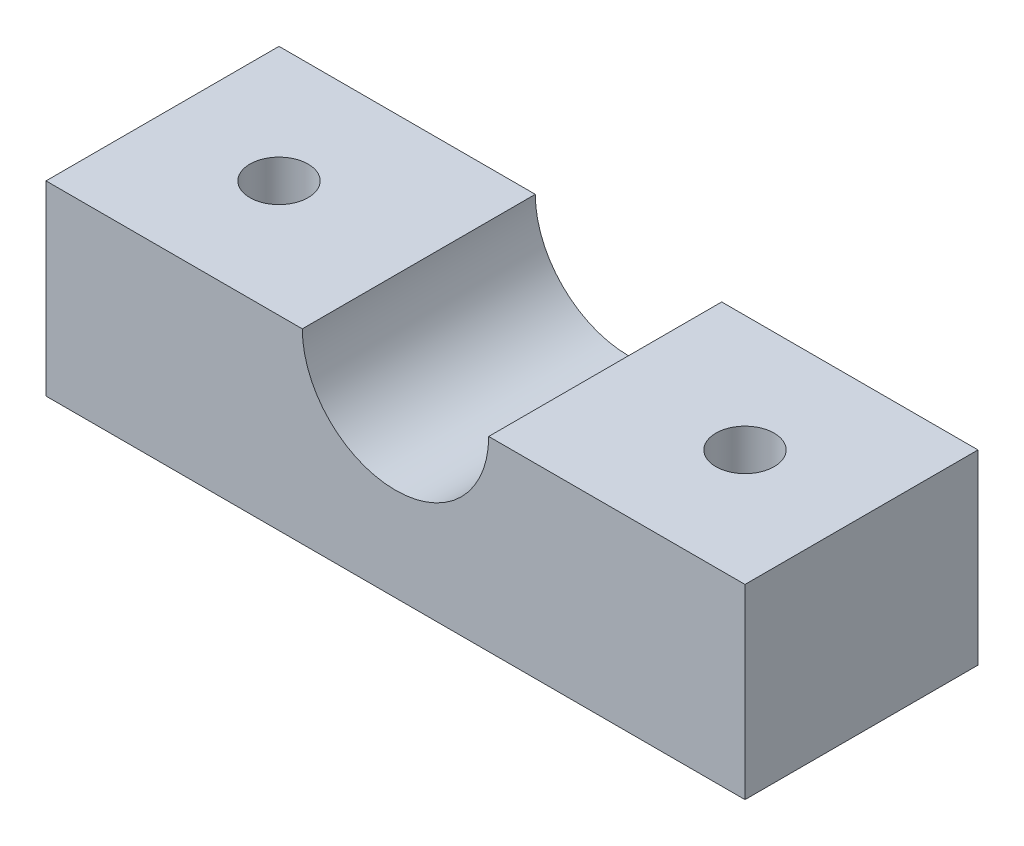
ISO-10303-21;
HEADER;
FILE_DESCRIPTION(('STEP AP214'),'2;1');
FILE_NAME('part.step','',(''),(''),'','','');
FILE_SCHEMA(('AUTOMOTIVE_DESIGN { 1 0 10303 214 1 1 1 1 }'));
ENDSEC;
DATA;
#1=APPLICATION_CONTEXT('core data for automotive mechanical design processes');
#2=APPLICATION_PROTOCOL_DEFINITION('international standard','automotive_design',2000,#1);
#3=PRODUCT_CONTEXT('',#1,'mechanical');
#4=PRODUCT('Part','Part','',(#3));
#5=PRODUCT_RELATED_PRODUCT_CATEGORY('part','',(#4));
#6=PRODUCT_DEFINITION_FORMATION('','',#4);
#7=PRODUCT_DEFINITION_CONTEXT('part definition',#1,'design');
#8=PRODUCT_DEFINITION('design','',#6,#7);
#9=PRODUCT_DEFINITION_SHAPE('','',#8);
#10=(LENGTH_UNIT() NAMED_UNIT(*) SI_UNIT(.MILLI.,.METRE.));
#11=(NAMED_UNIT(*) PLANE_ANGLE_UNIT() SI_UNIT($,.RADIAN.));
#12=(NAMED_UNIT(*) SI_UNIT($,.STERADIAN.) SOLID_ANGLE_UNIT());
#13=UNCERTAINTY_MEASURE_WITH_UNIT(LENGTH_MEASURE(1.E-05),#10,'distance_accuracy_value','');
#14=(GEOMETRIC_REPRESENTATION_CONTEXT(3) GLOBAL_UNCERTAINTY_ASSIGNED_CONTEXT((#13)) GLOBAL_UNIT_ASSIGNED_CONTEXT((#10,
#11,#12)) REPRESENTATION_CONTEXT('',''));
#15=CARTESIAN_POINT('',(0.,0.,0.));
#16=DIRECTION('',(0.,0.,1.));
#17=DIRECTION('',(1.,0.,0.));
#18=AXIS2_PLACEMENT_3D('',#15,#16,#17);
#19=CARTESIAN_POINT('',(0.,0.,10.));
#20=DIRECTION('',(0.,1.,0.));
#21=DIRECTION('',(0.,0.,1.));
#22=AXIS2_PLACEMENT_3D('',#19,#20,#21);
#23=PLANE('',#22);
#24=CARTESIAN_POINT('',(25.,0.,5.));
#25=DIRECTION('',(0.,-1.,0.));
#26=DIRECTION('',(0.,0.,-1.));
#27=AXIS2_PLACEMENT_3D('',#24,#25,#26);
#28=CIRCLE('',#27,1.25);
#29=CARTESIAN_POINT('',(25.,0.,3.75));
#30=VERTEX_POINT('',#29);
#31=EDGE_CURVE('E196',#30,#30,#28,.T.);
#32=ORIENTED_EDGE('',*,*,#31,.F.);
#33=EDGE_LOOP('',(#32));
#34=FACE_BOUND('',#33,.T.);
#35=DIRECTION('',(1.,0.,0.));
#36=VECTOR('',#35,1.);
#37=CARTESIAN_POINT('',(0.,0.,0.));
#38=LINE('',#37,#36);
#39=CARTESIAN_POINT('',(0.,0.,0.));
#40=VERTEX_POINT('',#39);
#41=CARTESIAN_POINT('',(30.,0.,0.));
#42=VERTEX_POINT('',#41);
#43=EDGE_CURVE('E137',#40,#42,#38,.T.);
#44=ORIENTED_EDGE('',*,*,#43,.T.);
#45=DIRECTION('',(0.,0.,-1.));
#46=VECTOR('',#45,1.);
#47=CARTESIAN_POINT('',(30.,0.,10.));
#48=LINE('',#47,#46);
#49=CARTESIAN_POINT('',(30.,0.,10.));
#50=VERTEX_POINT('',#49);
#51=EDGE_CURVE('E53',#50,#42,#48,.T.);
#52=ORIENTED_EDGE('',*,*,#51,.F.);
#53=DIRECTION('',(1.,0.,0.));
#54=VECTOR('',#53,1.);
#55=CARTESIAN_POINT('',(0.,0.,10.));
#56=LINE('',#55,#54);
#57=CARTESIAN_POINT('',(0.,0.,10.));
#58=VERTEX_POINT('',#57);
#59=EDGE_CURVE('E98',#58,#50,#56,.T.);
#60=ORIENTED_EDGE('',*,*,#59,.F.);
#61=DIRECTION('',(0.,0.,-1.));
#62=VECTOR('',#61,1.);
#63=CARTESIAN_POINT('',(0.,0.,10.));
#64=LINE('',#63,#62);
#65=EDGE_CURVE('E11',#58,#40,#64,.T.);
#66=ORIENTED_EDGE('',*,*,#65,.T.);
#67=EDGE_LOOP('',(#44,#52,#60,#66));
#68=FACE_BOUND('',#67,.T.);
#69=CARTESIAN_POINT('',(5.,0.,5.));
#70=DIRECTION('',(0.,-1.,0.));
#71=DIRECTION('',(0.,0.,-1.));
#72=AXIS2_PLACEMENT_3D('',#69,#70,#71);
#73=CIRCLE('',#72,1.25);
#74=CARTESIAN_POINT('',(5.,0.,3.75));
#75=VERTEX_POINT('',#74);
#76=EDGE_CURVE('E210',#75,#75,#73,.T.);
#77=ORIENTED_EDGE('',*,*,#76,.F.);
#78=EDGE_LOOP('',(#77));
#79=FACE_BOUND('',#78,.T.);
#80=ADVANCED_FACE('F43',(#34,#68,#79),#23,.F.);
#81=CARTESIAN_POINT('',(0.,0.,10.));
#82=DIRECTION('',(1.,0.,0.));
#83=DIRECTION('',(0.,0.,-1.));
#84=AXIS2_PLACEMENT_3D('',#81,#82,#83);
#85=PLANE('',#84);
#86=DIRECTION('',(0.,-1.,0.));
#87=VECTOR('',#86,1.);
#88=CARTESIAN_POINT('',(0.,0.,0.));
#89=LINE('',#88,#87);
#90=CARTESIAN_POINT('',(0.,8.,0.));
#91=VERTEX_POINT('',#90);
#92=EDGE_CURVE('E133',#91,#40,#89,.T.);
#93=ORIENTED_EDGE('',*,*,#92,.T.);
#94=ORIENTED_EDGE('',*,*,#65,.F.);
#95=DIRECTION('',(0.,-1.,0.));
#96=VECTOR('',#95,1.);
#97=CARTESIAN_POINT('',(0.,0.,10.));
#98=LINE('',#97,#96);
#99=CARTESIAN_POINT('',(0.,8.,10.));
#100=VERTEX_POINT('',#99);
#101=EDGE_CURVE('E150',#100,#58,#98,.T.);
#102=ORIENTED_EDGE('',*,*,#101,.F.);
#103=DIRECTION('',(0.,0.,-1.));
#104=VECTOR('',#103,1.);
#105=CARTESIAN_POINT('',(0.,8.,10.));
#106=LINE('',#105,#104);
#107=EDGE_CURVE('E129',#100,#91,#106,.T.);
#108=ORIENTED_EDGE('',*,*,#107,.T.);
#109=EDGE_LOOP('',(#93,#94,#102,#108));
#110=FACE_BOUND('',#109,.T.);
#111=ADVANCED_FACE('F45',(#110),#85,.F.);
#112=CARTESIAN_POINT('',(30.,0.,10.));
#113=DIRECTION('',(-1.,0.,0.));
#114=DIRECTION('',(0.,0.,1.));
#115=AXIS2_PLACEMENT_3D('',#112,#113,#114);
#116=PLANE('',#115);
#117=DIRECTION('',(0.,1.,0.));
#118=VECTOR('',#117,1.);
#119=CARTESIAN_POINT('',(30.,0.,0.));
#120=LINE('',#119,#118);
#121=CARTESIAN_POINT('',(30.,8.,0.));
#122=VERTEX_POINT('',#121);
#123=EDGE_CURVE('E141',#42,#122,#120,.T.);
#124=ORIENTED_EDGE('',*,*,#123,.T.);
#125=DIRECTION('',(0.,0.,-1.));
#126=VECTOR('',#125,1.);
#127=CARTESIAN_POINT('',(30.,8.,10.));
#128=LINE('',#127,#126);
#129=CARTESIAN_POINT('',(30.,8.,10.));
#130=VERTEX_POINT('',#129);
#131=EDGE_CURVE('E122',#130,#122,#128,.T.);
#132=ORIENTED_EDGE('',*,*,#131,.F.);
#133=DIRECTION('',(0.,1.,0.));
#134=VECTOR('',#133,1.);
#135=CARTESIAN_POINT('',(30.,0.,10.));
#136=LINE('',#135,#134);
#137=EDGE_CURVE('E111',#50,#130,#136,.T.);
#138=ORIENTED_EDGE('',*,*,#137,.F.);
#139=ORIENTED_EDGE('',*,*,#51,.T.);
#140=EDGE_LOOP('',(#124,#132,#138,#139));
#141=FACE_BOUND('',#140,.T.);
#142=ADVANCED_FACE('F160',(#141),#116,.F.);
#143=CARTESIAN_POINT('',(19.,8.,10.));
#144=DIRECTION('',(0.,-1.,0.));
#145=DIRECTION('',(0.,0.,-1.));
#146=AXIS2_PLACEMENT_3D('',#143,#144,#145);
#147=PLANE('',#146);
#148=CARTESIAN_POINT('',(25.,8.,5.));
#149=DIRECTION('',(0.,-1.,0.));
#150=DIRECTION('',(0.,0.,-1.));
#151=AXIS2_PLACEMENT_3D('',#148,#149,#150);
#152=CIRCLE('',#151,1.25);
#153=CARTESIAN_POINT('',(25.,8.,3.75));
#154=VERTEX_POINT('',#153);
#155=EDGE_CURVE('E138',#154,#154,#152,.T.);
#156=ORIENTED_EDGE('',*,*,#155,.T.);
#157=EDGE_LOOP('',(#156));
#158=FACE_BOUND('',#157,.T.);
#159=DIRECTION('',(-1.,0.,0.));
#160=VECTOR('',#159,1.);
#161=CARTESIAN_POINT('',(19.,8.,0.));
#162=LINE('',#161,#160);
#163=CARTESIAN_POINT('',(19.,8.,0.));
#164=VERTEX_POINT('',#163);
#165=EDGE_CURVE('E120',#122,#164,#162,.T.);
#166=ORIENTED_EDGE('',*,*,#165,.T.);
#167=DIRECTION('',(0.,0.,-1.));
#168=VECTOR('',#167,1.);
#169=CARTESIAN_POINT('',(19.,8.,10.));
#170=LINE('',#169,#168);
#171=CARTESIAN_POINT('',(19.,8.,10.));
#172=VERTEX_POINT('',#171);
#173=EDGE_CURVE('E117',#172,#164,#170,.T.);
#174=ORIENTED_EDGE('',*,*,#173,.F.);
#175=DIRECTION('',(-1.,0.,0.));
#176=VECTOR('',#175,1.);
#177=CARTESIAN_POINT('',(19.,8.,10.));
#178=LINE('',#177,#176);
#179=EDGE_CURVE('E105',#130,#172,#178,.T.);
#180=ORIENTED_EDGE('',*,*,#179,.F.);
#181=ORIENTED_EDGE('',*,*,#131,.T.);
#182=EDGE_LOOP('',(#166,#174,#180,#181));
#183=FACE_BOUND('',#182,.T.);
#184=ADVANCED_FACE('F118',(#158,#183),#147,.F.);
#185=CARTESIAN_POINT('',(15.,8.,10.));
#186=DIRECTION('',(0.,0.,-1.));
#187=DIRECTION('',(-1.,0.,0.));
#188=AXIS2_PLACEMENT_3D('',#185,#186,#187);
#189=CYLINDRICAL_SURFACE('',#188,4.);
#190=CARTESIAN_POINT('',(15.,8.,0.));
#191=DIRECTION('',(0.,0.,-1.));
#192=DIRECTION('',(1.,0.,0.));
#193=AXIS2_PLACEMENT_3D('',#190,#191,#192);
#194=CIRCLE('',#193,4.);
#195=CARTESIAN_POINT('',(11.,8.,0.));
#196=VERTEX_POINT('',#195);
#197=EDGE_CURVE('E84',#164,#196,#194,.T.);
#198=ORIENTED_EDGE('',*,*,#197,.T.);
#199=DIRECTION('',(0.,0.,-1.));
#200=VECTOR('',#199,1.);
#201=CARTESIAN_POINT('',(11.,8.,10.));
#202=LINE('',#201,#200);
#203=CARTESIAN_POINT('',(11.,8.,10.));
#204=VERTEX_POINT('',#203);
#205=EDGE_CURVE('E123',#204,#196,#202,.T.);
#206=ORIENTED_EDGE('',*,*,#205,.F.);
#207=CARTESIAN_POINT('',(15.,8.,10.));
#208=DIRECTION('',(0.,0.,-1.));
#209=DIRECTION('',(1.,0.,0.));
#210=AXIS2_PLACEMENT_3D('',#207,#208,#209);
#211=CIRCLE('',#210,4.);
#212=EDGE_CURVE('E109',#172,#204,#211,.T.);
#213=ORIENTED_EDGE('',*,*,#212,.F.);
#214=ORIENTED_EDGE('',*,*,#173,.T.);
#215=EDGE_LOOP('',(#198,#206,#213,#214));
#216=FACE_BOUND('',#215,.T.);
#217=ADVANCED_FACE('F125',(#216),#189,.F.);
#218=CARTESIAN_POINT('',(0.,8.,10.));
#219=DIRECTION('',(0.,-1.,0.));
#220=DIRECTION('',(0.,0.,-1.));
#221=AXIS2_PLACEMENT_3D('',#218,#219,#220);
#222=PLANE('',#221);
#223=CARTESIAN_POINT('',(5.,8.,5.));
#224=DIRECTION('',(0.,-1.,0.));
#225=DIRECTION('',(0.,0.,-1.));
#226=AXIS2_PLACEMENT_3D('',#223,#224,#225);
#227=CIRCLE('',#226,1.25);
#228=CARTESIAN_POINT('',(5.,8.,3.75));
#229=VERTEX_POINT('',#228);
#230=EDGE_CURVE('E200',#229,#229,#227,.T.);
#231=ORIENTED_EDGE('',*,*,#230,.T.);
#232=EDGE_LOOP('',(#231));
#233=FACE_BOUND('',#232,.T.);
#234=DIRECTION('',(-1.,0.,0.));
#235=VECTOR('',#234,1.);
#236=CARTESIAN_POINT('',(0.,8.,0.));
#237=LINE('',#236,#235);
#238=EDGE_CURVE('E90',#196,#91,#237,.T.);
#239=ORIENTED_EDGE('',*,*,#238,.T.);
#240=ORIENTED_EDGE('',*,*,#107,.F.);
#241=DIRECTION('',(-1.,0.,0.));
#242=VECTOR('',#241,1.);
#243=CARTESIAN_POINT('',(0.,8.,10.));
#244=LINE('',#243,#242);
#245=EDGE_CURVE('E61',#204,#100,#244,.T.);
#246=ORIENTED_EDGE('',*,*,#245,.F.);
#247=ORIENTED_EDGE('',*,*,#205,.T.);
#248=EDGE_LOOP('',(#239,#240,#246,#247));
#249=FACE_BOUND('',#248,.T.);
#250=ADVANCED_FACE('F167',(#233,#249),#222,.F.);
#251=CARTESIAN_POINT('',(15.,8.,10.));
#252=DIRECTION('',(0.,0.,1.));
#253=DIRECTION('',(1.,0.,0.));
#254=AXIS2_PLACEMENT_3D('',#251,#252,#253);
#255=PLANE('',#254);
#256=ORIENTED_EDGE('',*,*,#101,.T.);
#257=ORIENTED_EDGE('',*,*,#59,.T.);
#258=ORIENTED_EDGE('',*,*,#137,.T.);
#259=ORIENTED_EDGE('',*,*,#179,.T.);
#260=ORIENTED_EDGE('',*,*,#212,.T.);
#261=ORIENTED_EDGE('',*,*,#245,.T.);
#262=EDGE_LOOP('',(#256,#257,#258,#259,#260,#261));
#263=FACE_BOUND('',#262,.T.);
#264=ADVANCED_FACE('F107',(#263),#255,.T.);
#265=CARTESIAN_POINT('',(15.,8.,0.));
#266=DIRECTION('',(0.,0.,1.));
#267=DIRECTION('',(1.,0.,0.));
#268=AXIS2_PLACEMENT_3D('',#265,#266,#267);
#269=PLANE('',#268);
#270=ORIENTED_EDGE('',*,*,#92,.F.);
#271=ORIENTED_EDGE('',*,*,#238,.F.);
#272=ORIENTED_EDGE('',*,*,#197,.F.);
#273=ORIENTED_EDGE('',*,*,#165,.F.);
#274=ORIENTED_EDGE('',*,*,#123,.F.);
#275=ORIENTED_EDGE('',*,*,#43,.F.);
#276=EDGE_LOOP('',(#270,#271,#272,#273,#274,#275));
#277=FACE_BOUND('',#276,.T.);
#278=ADVANCED_FACE('F163',(#277),#269,.F.);
#279=CARTESIAN_POINT('',(25.,0.,5.));
#280=DIRECTION('',(0.,-1.,0.));
#281=DIRECTION('',(0.,0.,-1.));
#282=AXIS2_PLACEMENT_3D('',#279,#280,#281);
#283=CYLINDRICAL_SURFACE('',#282,1.25);
#284=ORIENTED_EDGE('',*,*,#155,.F.);
#285=EDGE_LOOP('',(#284));
#286=FACE_BOUND('',#285,.T.);
#287=ORIENTED_EDGE('',*,*,#31,.T.);
#288=EDGE_LOOP('',(#287));
#289=FACE_BOUND('',#288,.T.);
#290=ADVANCED_FACE('F218',(#286,#289),#283,.F.);
#291=CARTESIAN_POINT('',(5.,0.,5.));
#292=DIRECTION('',(0.,-1.,0.));
#293=DIRECTION('',(0.,0.,-1.));
#294=AXIS2_PLACEMENT_3D('',#291,#292,#293);
#295=CYLINDRICAL_SURFACE('',#294,1.25);
#296=ORIENTED_EDGE('',*,*,#230,.F.);
#297=EDGE_LOOP('',(#296));
#298=FACE_BOUND('',#297,.T.);
#299=ORIENTED_EDGE('',*,*,#76,.T.);
#300=EDGE_LOOP('',(#299));
#301=FACE_BOUND('',#300,.T.);
#302=ADVANCED_FACE('F215',(#298,#301),#295,.F.);
#303=CLOSED_SHELL('',(#80,#111,#142,#184,#217,#250,#264,#278,#290,#302));
#304=MANIFOLD_SOLID_BREP('B2',#303);
#305=ADVANCED_BREP_SHAPE_REPRESENTATION('',(#18,#304),#14);
#306=SHAPE_DEFINITION_REPRESENTATION(#9,#305);
ENDSEC;
END-ISO-10303-21;
